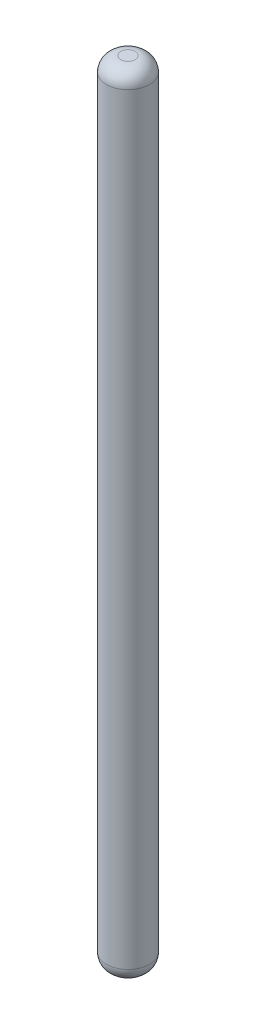
ISO-10303-21;
HEADER;
FILE_DESCRIPTION(('STEP AP214'),'2;1');
FILE_NAME('part.step','',(''),(''),'','','');
FILE_SCHEMA(('AUTOMOTIVE_DESIGN { 1 0 10303 214 1 1 1 1 }'));
ENDSEC;
DATA;
#1=APPLICATION_CONTEXT('core data for automotive mechanical design processes');
#2=APPLICATION_PROTOCOL_DEFINITION('international standard','automotive_design',2000,#1);
#3=PRODUCT_CONTEXT('',#1,'mechanical');
#4=PRODUCT('Part','Part','',(#3));
#5=PRODUCT_RELATED_PRODUCT_CATEGORY('part','',(#4));
#6=PRODUCT_DEFINITION_FORMATION('','',#4);
#7=PRODUCT_DEFINITION_CONTEXT('part definition',#1,'design');
#8=PRODUCT_DEFINITION('design','',#6,#7);
#9=PRODUCT_DEFINITION_SHAPE('','',#8);
#10=(LENGTH_UNIT() NAMED_UNIT(*) SI_UNIT(.MILLI.,.METRE.));
#11=(NAMED_UNIT(*) PLANE_ANGLE_UNIT() SI_UNIT($,.RADIAN.));
#12=(NAMED_UNIT(*) SI_UNIT($,.STERADIAN.) SOLID_ANGLE_UNIT());
#13=UNCERTAINTY_MEASURE_WITH_UNIT(LENGTH_MEASURE(1.E-05),#10,'distance_accuracy_value','');
#14=(GEOMETRIC_REPRESENTATION_CONTEXT(3) GLOBAL_UNCERTAINTY_ASSIGNED_CONTEXT((#13)) GLOBAL_UNIT_ASSIGNED_CONTEXT((#10,
#11,#12)) REPRESENTATION_CONTEXT('',''));
#15=CARTESIAN_POINT('',(0.,0.,0.));
#16=DIRECTION('',(0.,0.,1.));
#17=DIRECTION('',(1.,0.,0.));
#18=AXIS2_PLACEMENT_3D('',#15,#16,#17);
#19=CARTESIAN_POINT('',(0.,55.,0.));
#20=DIRECTION('',(0.,-1.,0.));
#21=DIRECTION('',(0.,0.,-1.));
#22=AXIS2_PLACEMENT_3D('',#19,#20,#21);
#23=CYLINDRICAL_SURFACE('',#22,1.5);
#24=CARTESIAN_POINT('',(0.,1.,0.));
#25=DIRECTION('',(0.,1.,0.));
#26=DIRECTION('',(0.,0.,1.));
#27=AXIS2_PLACEMENT_3D('',#24,#25,#26);
#28=CIRCLE('',#27,1.5);
#29=CARTESIAN_POINT('',(0.,1.,1.5));
#30=VERTEX_POINT('',#29);
#31=EDGE_CURVE('E43',#30,#30,#28,.T.);
#32=ORIENTED_EDGE('',*,*,#31,.T.);
#33=EDGE_LOOP('',(#32));
#34=FACE_BOUND('',#33,.T.);
#35=CARTESIAN_POINT('',(0.,54.,0.));
#36=DIRECTION('',(0.,1.,0.));
#37=DIRECTION('',(0.,0.,1.));
#38=AXIS2_PLACEMENT_3D('',#35,#36,#37);
#39=CIRCLE('',#38,1.5);
#40=CARTESIAN_POINT('',(0.,54.,1.5));
#41=VERTEX_POINT('',#40);
#42=EDGE_CURVE('E47',#41,#41,#39,.F.);
#43=ORIENTED_EDGE('',*,*,#42,.T.);
#44=EDGE_LOOP('',(#43));
#45=FACE_BOUND('',#44,.T.);
#46=ADVANCED_FACE('F32',(#34,#45),#23,.T.);
#47=CARTESIAN_POINT('',(0.,55.,0.));
#48=DIRECTION('',(0.,1.,0.));
#49=DIRECTION('',(0.,0.,1.));
#50=AXIS2_PLACEMENT_3D('',#47,#48,#49);
#51=PLANE('',#50);
#52=CARTESIAN_POINT('',(0.,55.,0.));
#53=DIRECTION('',(0.,1.,0.));
#54=DIRECTION('',(0.,0.,1.));
#55=AXIS2_PLACEMENT_3D('',#52,#53,#54);
#56=CIRCLE('',#55,0.5);
#57=CARTESIAN_POINT('',(0.,55.,0.5));
#58=VERTEX_POINT('',#57);
#59=EDGE_CURVE('E10',#58,#58,#56,.T.);
#60=ORIENTED_EDGE('',*,*,#59,.T.);
#61=EDGE_LOOP('',(#60));
#62=FACE_BOUND('',#61,.T.);
#63=ADVANCED_FACE('F63',(#62),#51,.T.);
#64=CARTESIAN_POINT('',(0.,0.,0.));
#65=DIRECTION('',(0.,1.,0.));
#66=DIRECTION('',(0.,0.,1.));
#67=AXIS2_PLACEMENT_3D('',#64,#65,#66);
#68=PLANE('',#67);
#69=CARTESIAN_POINT('',(0.,0.,0.));
#70=DIRECTION('',(0.,1.,0.));
#71=DIRECTION('',(0.,0.,1.));
#72=AXIS2_PLACEMENT_3D('',#69,#70,#71);
#73=CIRCLE('',#72,0.5);
#74=CARTESIAN_POINT('',(0.,0.,0.5));
#75=VERTEX_POINT('',#74);
#76=EDGE_CURVE('E39',#75,#75,#73,.F.);
#77=ORIENTED_EDGE('',*,*,#76,.T.);
#78=EDGE_LOOP('',(#77));
#79=FACE_BOUND('',#78,.T.);
#80=ADVANCED_FACE('F60',(#79),#68,.F.);
#81=CARTESIAN_POINT('',(0.,1.,0.));
#82=DIRECTION('',(0.,1.,0.));
#83=DIRECTION('',(0.,0.,1.));
#84=AXIS2_PLACEMENT_3D('',#81,#82,#83);
#85=DEGENERATE_TOROIDAL_SURFACE('',#84,0.5,1.,.T.);
#86=ORIENTED_EDGE('',*,*,#76,.F.);
#87=EDGE_LOOP('',(#86));
#88=FACE_BOUND('',#87,.T.);
#89=ORIENTED_EDGE('',*,*,#31,.F.);
#90=EDGE_LOOP('',(#89));
#91=FACE_BOUND('',#90,.T.);
#92=ADVANCED_FACE('F56',(#88,#91),#85,.T.);
#93=CARTESIAN_POINT('',(0.,54.,0.));
#94=DIRECTION('',(0.,1.,0.));
#95=DIRECTION('',(0.,0.,1.));
#96=AXIS2_PLACEMENT_3D('',#93,#94,#95);
#97=DEGENERATE_TOROIDAL_SURFACE('',#96,0.5,1.,.T.);
#98=ORIENTED_EDGE('',*,*,#42,.F.);
#99=EDGE_LOOP('',(#98));
#100=FACE_BOUND('',#99,.T.);
#101=ORIENTED_EDGE('',*,*,#59,.F.);
#102=EDGE_LOOP('',(#101));
#103=FACE_BOUND('',#102,.T.);
#104=ADVANCED_FACE('F34',(#100,#103),#97,.T.);
#105=CLOSED_SHELL('',(#46,#63,#80,#92,#104));
#106=MANIFOLD_SOLID_BREP('B2',#105);
#107=ADVANCED_BREP_SHAPE_REPRESENTATION('',(#18,#106),#14);
#108=SHAPE_DEFINITION_REPRESENTATION(#9,#107);
ENDSEC;
END-ISO-10303-21;
